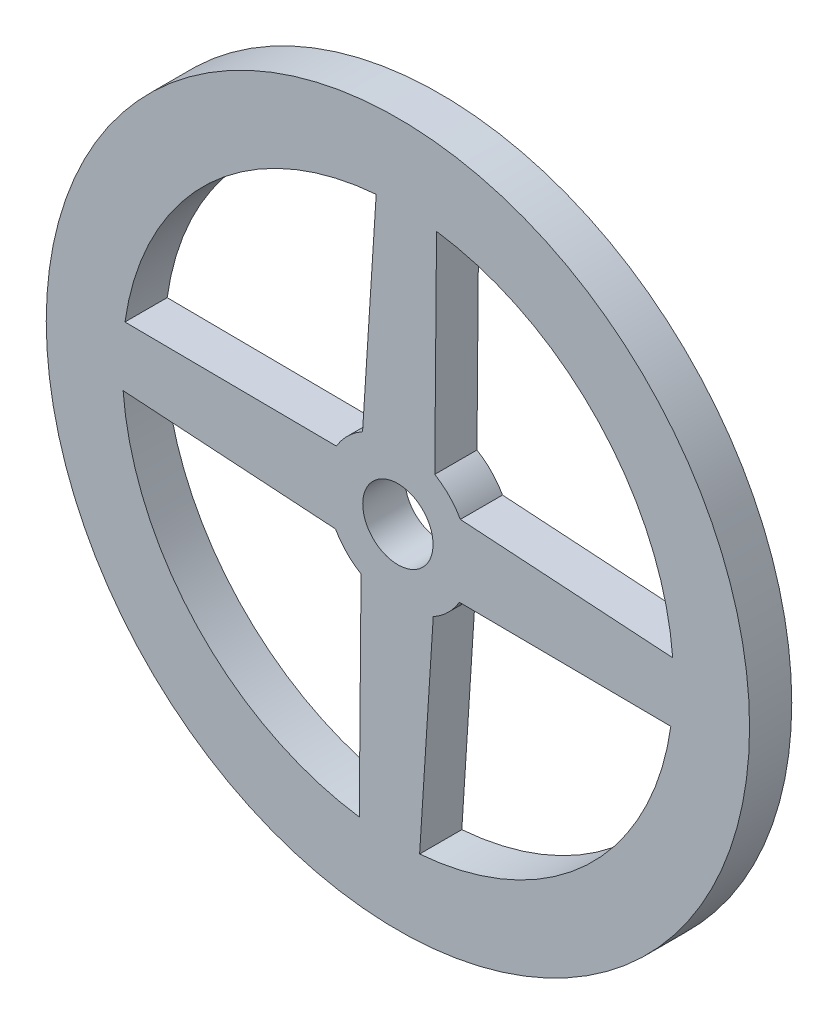
ISO-10303-21;
HEADER;
FILE_DESCRIPTION(('STEP AP214'),'2;1');
FILE_NAME('part.step','',(''),(''),'','','');
FILE_SCHEMA(('AUTOMOTIVE_DESIGN { 1 0 10303 214 1 1 1 1 }'));
ENDSEC;
DATA;
#1=APPLICATION_CONTEXT('core data for automotive mechanical design processes');
#2=APPLICATION_PROTOCOL_DEFINITION('international standard','automotive_design',2000,#1);
#3=PRODUCT_CONTEXT('',#1,'mechanical');
#4=PRODUCT('Part','Part','',(#3));
#5=PRODUCT_RELATED_PRODUCT_CATEGORY('part','',(#4));
#6=PRODUCT_DEFINITION_FORMATION('','',#4);
#7=PRODUCT_DEFINITION_CONTEXT('part definition',#1,'design');
#8=PRODUCT_DEFINITION('design','',#6,#7);
#9=PRODUCT_DEFINITION_SHAPE('','',#8);
#10=(LENGTH_UNIT() NAMED_UNIT(*) SI_UNIT(.MILLI.,.METRE.));
#11=(NAMED_UNIT(*) PLANE_ANGLE_UNIT() SI_UNIT($,.RADIAN.));
#12=(NAMED_UNIT(*) SI_UNIT($,.STERADIAN.) SOLID_ANGLE_UNIT());
#13=UNCERTAINTY_MEASURE_WITH_UNIT(LENGTH_MEASURE(1.E-05),#10,'distance_accuracy_value','');
#14=(GEOMETRIC_REPRESENTATION_CONTEXT(3) GLOBAL_UNCERTAINTY_ASSIGNED_CONTEXT((#13)) GLOBAL_UNIT_ASSIGNED_CONTEXT((#10,
#11,#12)) REPRESENTATION_CONTEXT('',''));
#15=CARTESIAN_POINT('',(0.,0.,0.));
#16=DIRECTION('',(0.,0.,1.));
#17=DIRECTION('',(1.,0.,0.));
#18=AXIS2_PLACEMENT_3D('',#15,#16,#17);
#19=CARTESIAN_POINT('',(0.,0.,3.));
#20=DIRECTION('',(0.,0.,1.));
#21=DIRECTION('',(1.,0.,0.));
#22=AXIS2_PLACEMENT_3D('',#19,#20,#21);
#23=PLANE('',#22);
#24=CARTESIAN_POINT('',(0.,0.,3.));
#25=DIRECTION('',(0.,0.,-1.));
#26=DIRECTION('',(-1.,0.,0.));
#27=AXIS2_PLACEMENT_3D('',#24,#25,#26);
#28=CIRCLE('',#27,2.5);
#29=CARTESIAN_POINT('',(-2.5,0.,3.));
#30=VERTEX_POINT('',#29);
#31=EDGE_CURVE('E174',#30,#30,#28,.T.);
#32=ORIENTED_EDGE('',*,*,#31,.T.);
#33=EDGE_LOOP('',(#32));
#34=FACE_BOUND('',#33,.T.);
#35=CARTESIAN_POINT('',(0.,0.,3.));
#36=DIRECTION('',(0.,0.,1.));
#37=DIRECTION('',(1.,0.,0.));
#38=AXIS2_PLACEMENT_3D('',#35,#36,#37);
#39=CIRCLE('',#38,25.);
#40=CARTESIAN_POINT('',(25.,0.,3.));
#41=VERTEX_POINT('',#40);
#42=EDGE_CURVE('E11',#41,#41,#39,.T.);
#43=ORIENTED_EDGE('',*,*,#42,.T.);
#44=EDGE_LOOP('',(#43));
#45=FACE_BOUND('',#44,.T.);
#46=DIRECTION('',(-0.00834775394439594,-0.999965156895021,0.));
#47=VECTOR('',#46,1.);
#48=CARTESIAN_POINT('',(2.74591126191305,19.4019976039828,3.));
#49=LINE('',#48,#47);
#50=CARTESIAN_POINT('',(2.74591126191305,19.4019976039828,3.));
#51=VERTEX_POINT('',#50);
#52=CARTESIAN_POINT('',(2.6204739005013,4.37604072742611,3.));
#53=VERTEX_POINT('',#52);
#54=EDGE_CURVE('E248',#51,#53,#49,.T.);
#55=ORIENTED_EDGE('',*,*,#54,.F.);
#56=CARTESIAN_POINT('',(0.,0.,3.));
#57=DIRECTION('',(0.,0.,1.));
#58=DIRECTION('',(-1.,0.,0.));
#59=AXIS2_PLACEMENT_3D('',#56,#57,#58);
#60=CIRCLE('',#59,19.5953448472655);
#61=CARTESIAN_POINT('',(19.5344733282336,1.54333776983081,3.));
#62=VERTEX_POINT('',#61);
#63=EDGE_CURVE('E246',#62,#51,#60,.T.);
#64=ORIENTED_EDGE('',*,*,#63,.F.);
#65=DIRECTION('',(0.997945295130962,-0.0640717404631415,0.));
#66=VECTOR('',#65,1.);
#67=CARTESIAN_POINT('',(4.43889784814874,2.51252896600238,3.));
#68=LINE('',#67,#66);
#69=CARTESIAN_POINT('',(4.43889784814874,2.51252896600238,3.));
#70=VERTEX_POINT('',#69);
#71=EDGE_CURVE('E254',#70,#62,#68,.T.);
#72=ORIENTED_EDGE('',*,*,#71,.F.);
#73=CARTESIAN_POINT('',(0.,0.,3.));
#74=DIRECTION('',(0.,0.,-1.));
#75=DIRECTION('',(-1.,0.,0.));
#76=AXIS2_PLACEMENT_3D('',#73,#74,#75);
#77=CIRCLE('',#76,5.10064857751448);
#78=EDGE_CURVE('E251',#53,#70,#77,.T.);
#79=ORIENTED_EDGE('',*,*,#78,.F.);
#80=EDGE_LOOP('',(#55,#64,#72,#79));
#81=FACE_BOUND('',#80,.T.);
#82=DIRECTION('',(-0.999965156895021,0.00834775394439591,0.));
#83=VECTOR('',#82,1.);
#84=CARTESIAN_POINT('',(19.4019976039828,-2.74591126191305,3.));
#85=LINE('',#84,#83);
#86=CARTESIAN_POINT('',(19.4019976039828,-2.74591126191305,3.));
#87=VERTEX_POINT('',#86);
#88=CARTESIAN_POINT('',(4.37604072742611,-2.6204739005013,3.));
#89=VERTEX_POINT('',#88);
#90=EDGE_CURVE('E217',#87,#89,#85,.T.);
#91=ORIENTED_EDGE('',*,*,#90,.F.);
#92=CARTESIAN_POINT('',(0.,0.,3.));
#93=DIRECTION('',(0.,0.,1.));
#94=DIRECTION('',(-1.,0.,0.));
#95=AXIS2_PLACEMENT_3D('',#92,#93,#94);
#96=CIRCLE('',#95,19.5953448472655);
#97=CARTESIAN_POINT('',(1.54333776983082,-19.5344733282336,3.));
#98=VERTEX_POINT('',#97);
#99=EDGE_CURVE('E215',#98,#87,#96,.T.);
#100=ORIENTED_EDGE('',*,*,#99,.F.);
#101=DIRECTION('',(-0.0640717404631404,-0.997945295130963,0.));
#102=VECTOR('',#101,1.);
#103=CARTESIAN_POINT('',(2.51252896600236,-4.43889784814875,3.));
#104=LINE('',#103,#102);
#105=CARTESIAN_POINT('',(2.51252896600236,-4.43889784814875,3.));
#106=VERTEX_POINT('',#105);
#107=EDGE_CURVE('E223',#106,#98,#104,.T.);
#108=ORIENTED_EDGE('',*,*,#107,.F.);
#109=CARTESIAN_POINT('',(0.,0.,3.));
#110=DIRECTION('',(0.,0.,-1.));
#111=DIRECTION('',(-1.,0.,0.));
#112=AXIS2_PLACEMENT_3D('',#109,#110,#111);
#113=CIRCLE('',#112,5.10064857751448);
#114=EDGE_CURVE('E220',#89,#106,#113,.T.);
#115=ORIENTED_EDGE('',*,*,#114,.F.);
#116=EDGE_LOOP('',(#91,#100,#108,#115));
#117=FACE_BOUND('',#116,.T.);
#118=DIRECTION('',(0.00834775394439579,0.999965156895021,0.));
#119=VECTOR('',#118,1.);
#120=CARTESIAN_POINT('',(-2.74591126191305,-19.4019976039828,3.));
#121=LINE('',#120,#119);
#122=CARTESIAN_POINT('',(-2.74591126191305,-19.4019976039828,3.));
#123=VERTEX_POINT('',#122);
#124=CARTESIAN_POINT('',(-2.6204739005013,-4.37604072742611,3.));
#125=VERTEX_POINT('',#124);
#126=EDGE_CURVE('E186',#123,#125,#121,.T.);
#127=ORIENTED_EDGE('',*,*,#126,.F.);
#128=CARTESIAN_POINT('',(0.,0.,3.));
#129=DIRECTION('',(0.,0.,1.));
#130=DIRECTION('',(-1.,0.,0.));
#131=AXIS2_PLACEMENT_3D('',#128,#129,#130);
#132=CIRCLE('',#131,19.5953448472655);
#133=CARTESIAN_POINT('',(-19.5344733282336,-1.54333776983082,3.));
#134=VERTEX_POINT('',#133);
#135=EDGE_CURVE('E184',#134,#123,#132,.T.);
#136=ORIENTED_EDGE('',*,*,#135,.F.);
#137=DIRECTION('',(-0.997945295130963,0.0640717404631394,0.));
#138=VECTOR('',#137,1.);
#139=CARTESIAN_POINT('',(-4.43889784814876,-2.51252896600235,3.));
#140=LINE('',#139,#138);
#141=CARTESIAN_POINT('',(-4.43889784814876,-2.51252896600234,3.));
#142=VERTEX_POINT('',#141);
#143=EDGE_CURVE('E192',#142,#134,#140,.T.);
#144=ORIENTED_EDGE('',*,*,#143,.F.);
#145=CARTESIAN_POINT('',(0.,0.,3.));
#146=DIRECTION('',(0.,0.,-1.));
#147=DIRECTION('',(-1.,0.,0.));
#148=AXIS2_PLACEMENT_3D('',#145,#146,#147);
#149=CIRCLE('',#148,5.10064857751448);
#150=EDGE_CURVE('E189',#125,#142,#149,.T.);
#151=ORIENTED_EDGE('',*,*,#150,.F.);
#152=EDGE_LOOP('',(#127,#136,#144,#151));
#153=FACE_BOUND('',#152,.T.);
#154=DIRECTION('',(0.999965156895021,-0.00834775394439576,0.));
#155=VECTOR('',#154,1.);
#156=CARTESIAN_POINT('',(-19.4019976039828,2.74591126191305,3.));
#157=LINE('',#156,#155);
#158=CARTESIAN_POINT('',(-19.4019976039828,2.74591126191305,3.));
#159=VERTEX_POINT('',#158);
#160=CARTESIAN_POINT('',(-4.37604072742611,2.6204739005013,3.));
#161=VERTEX_POINT('',#160);
#162=EDGE_CURVE('E154',#159,#161,#157,.T.);
#163=ORIENTED_EDGE('',*,*,#162,.F.);
#164=CARTESIAN_POINT('',(0.,0.,3.));
#165=DIRECTION('',(0.,0.,1.));
#166=DIRECTION('',(-1.,0.,0.));
#167=AXIS2_PLACEMENT_3D('',#164,#165,#166);
#168=CIRCLE('',#167,19.5953448472655);
#169=CARTESIAN_POINT('',(-1.54333776983082,19.5344733282336,3.));
#170=VERTEX_POINT('',#169);
#171=EDGE_CURVE('E146',#170,#159,#168,.T.);
#172=ORIENTED_EDGE('',*,*,#171,.F.);
#173=DIRECTION('',(0.0640717404631383,0.997945295130963,0.));
#174=VECTOR('',#173,1.);
#175=CARTESIAN_POINT('',(-2.51252896600233,4.43889784814877,3.));
#176=LINE('',#175,#174);
#177=CARTESIAN_POINT('',(-2.51252896600233,4.43889784814877,3.));
#178=VERTEX_POINT('',#177);
#179=EDGE_CURVE('E168',#178,#170,#176,.T.);
#180=ORIENTED_EDGE('',*,*,#179,.F.);
#181=CARTESIAN_POINT('',(0.,0.,3.));
#182=DIRECTION('',(0.,0.,-1.));
#183=DIRECTION('',(-1.,0.,0.));
#184=AXIS2_PLACEMENT_3D('',#181,#182,#183);
#185=CIRCLE('',#184,5.10064857751448);
#186=EDGE_CURVE('E166',#161,#178,#185,.T.);
#187=ORIENTED_EDGE('',*,*,#186,.F.);
#188=EDGE_LOOP('',(#163,#172,#180,#187));
#189=FACE_BOUND('',#188,.T.);
#190=ADVANCED_FACE('F33',(#34,#45,#81,#117,#153,#189),#23,.T.);
#191=CARTESIAN_POINT('',(0.,0.,0.));
#192=DIRECTION('',(0.,0.,1.));
#193=DIRECTION('',(1.,0.,0.));
#194=AXIS2_PLACEMENT_3D('',#191,#192,#193);
#195=PLANE('',#194);
#196=CARTESIAN_POINT('',(0.,0.,0.));
#197=DIRECTION('',(0.,0.,-1.));
#198=DIRECTION('',(-1.,0.,0.));
#199=AXIS2_PLACEMENT_3D('',#196,#197,#198);
#200=CIRCLE('',#199,2.5);
#201=CARTESIAN_POINT('',(-2.5,0.,0.));
#202=VERTEX_POINT('',#201);
#203=EDGE_CURVE('E509',#202,#202,#200,.T.);
#204=ORIENTED_EDGE('',*,*,#203,.F.);
#205=EDGE_LOOP('',(#204));
#206=FACE_BOUND('',#205,.T.);
#207=CARTESIAN_POINT('',(0.,0.,0.));
#208=DIRECTION('',(0.,0.,1.));
#209=DIRECTION('',(-1.,0.,0.));
#210=AXIS2_PLACEMENT_3D('',#207,#208,#209);
#211=CIRCLE('',#210,19.5953448472655);
#212=CARTESIAN_POINT('',(-19.5344733282336,-1.54333776983082,0.));
#213=VERTEX_POINT('',#212);
#214=CARTESIAN_POINT('',(-2.74591126191305,-19.4019976039828,0.));
#215=VERTEX_POINT('',#214);
#216=EDGE_CURVE('E162',#213,#215,#211,.T.);
#217=ORIENTED_EDGE('',*,*,#216,.T.);
#218=DIRECTION('',(0.00834775394439579,0.999965156895021,0.));
#219=VECTOR('',#218,1.);
#220=CARTESIAN_POINT('',(-2.74591126191305,-19.4019976039828,0.));
#221=LINE('',#220,#219);
#222=CARTESIAN_POINT('',(-2.6204739005013,-4.37604072742611,0.));
#223=VERTEX_POINT('',#222);
#224=EDGE_CURVE('E197',#215,#223,#221,.T.);
#225=ORIENTED_EDGE('',*,*,#224,.T.);
#226=CARTESIAN_POINT('',(0.,0.,0.));
#227=DIRECTION('',(0.,0.,-1.));
#228=DIRECTION('',(-1.,0.,0.));
#229=AXIS2_PLACEMENT_3D('',#226,#227,#228);
#230=CIRCLE('',#229,5.10064857751448);
#231=CARTESIAN_POINT('',(-4.43889784814876,-2.51252896600234,0.));
#232=VERTEX_POINT('',#231);
#233=EDGE_CURVE('E200',#223,#232,#230,.T.);
#234=ORIENTED_EDGE('',*,*,#233,.T.);
#235=DIRECTION('',(-0.997945295130963,0.0640717404631394,0.));
#236=VECTOR('',#235,1.);
#237=CARTESIAN_POINT('',(-4.43889784814876,-2.51252896600235,0.));
#238=LINE('',#237,#236);
#239=EDGE_CURVE('E187',#232,#213,#238,.T.);
#240=ORIENTED_EDGE('',*,*,#239,.T.);
#241=EDGE_LOOP('',(#217,#225,#234,#240));
#242=FACE_BOUND('',#241,.T.);
#243=CARTESIAN_POINT('',(0.,0.,0.));
#244=DIRECTION('',(0.,0.,1.));
#245=DIRECTION('',(-1.,0.,0.));
#246=AXIS2_PLACEMENT_3D('',#243,#244,#245);
#247=CIRCLE('',#246,19.5953448472655);
#248=CARTESIAN_POINT('',(19.5344733282336,1.54333776983081,0.));
#249=VERTEX_POINT('',#248);
#250=CARTESIAN_POINT('',(2.74591126191305,19.4019976039828,0.));
#251=VERTEX_POINT('',#250);
#252=EDGE_CURVE('E245',#249,#251,#247,.T.);
#253=ORIENTED_EDGE('',*,*,#252,.T.);
#254=DIRECTION('',(-0.00834775394439594,-0.999965156895021,0.));
#255=VECTOR('',#254,1.);
#256=CARTESIAN_POINT('',(2.74591126191305,19.4019976039828,0.));
#257=LINE('',#256,#255);
#258=CARTESIAN_POINT('',(2.6204739005013,4.37604072742611,0.));
#259=VERTEX_POINT('',#258);
#260=EDGE_CURVE('E259',#251,#259,#257,.T.);
#261=ORIENTED_EDGE('',*,*,#260,.T.);
#262=CARTESIAN_POINT('',(0.,0.,0.));
#263=DIRECTION('',(0.,0.,-1.));
#264=DIRECTION('',(-1.,0.,0.));
#265=AXIS2_PLACEMENT_3D('',#262,#263,#264);
#266=CIRCLE('',#265,5.10064857751448);
#267=CARTESIAN_POINT('',(4.43889784814874,2.51252896600238,0.));
#268=VERTEX_POINT('',#267);
#269=EDGE_CURVE('E262',#259,#268,#266,.T.);
#270=ORIENTED_EDGE('',*,*,#269,.T.);
#271=DIRECTION('',(0.997945295130962,-0.0640717404631415,0.));
#272=VECTOR('',#271,1.);
#273=CARTESIAN_POINT('',(4.43889784814874,2.51252896600238,0.));
#274=LINE('',#273,#272);
#275=EDGE_CURVE('E249',#268,#249,#274,.T.);
#276=ORIENTED_EDGE('',*,*,#275,.T.);
#277=EDGE_LOOP('',(#253,#261,#270,#276));
#278=FACE_BOUND('',#277,.T.);
#279=CARTESIAN_POINT('',(0.,0.,0.));
#280=DIRECTION('',(0.,0.,1.));
#281=DIRECTION('',(1.,0.,0.));
#282=AXIS2_PLACEMENT_3D('',#279,#280,#281);
#283=CIRCLE('',#282,25.);
#284=CARTESIAN_POINT('',(25.,0.,0.));
#285=VERTEX_POINT('',#284);
#286=EDGE_CURVE('E37',#285,#285,#283,.T.);
#287=ORIENTED_EDGE('',*,*,#286,.F.);
#288=EDGE_LOOP('',(#287));
#289=FACE_BOUND('',#288,.T.);
#290=CARTESIAN_POINT('',(0.,0.,0.));
#291=DIRECTION('',(0.,0.,1.));
#292=DIRECTION('',(-1.,0.,0.));
#293=AXIS2_PLACEMENT_3D('',#290,#291,#292);
#294=CIRCLE('',#293,19.5953448472655);
#295=CARTESIAN_POINT('',(1.54333776983082,-19.5344733282336,0.));
#296=VERTEX_POINT('',#295);
#297=CARTESIAN_POINT('',(19.4019976039828,-2.74591126191305,0.));
#298=VERTEX_POINT('',#297);
#299=EDGE_CURVE('E214',#296,#298,#294,.T.);
#300=ORIENTED_EDGE('',*,*,#299,.T.);
#301=DIRECTION('',(-0.999965156895021,0.00834775394439591,0.));
#302=VECTOR('',#301,1.);
#303=CARTESIAN_POINT('',(19.4019976039828,-2.74591126191305,0.));
#304=LINE('',#303,#302);
#305=CARTESIAN_POINT('',(4.37604072742611,-2.6204739005013,0.));
#306=VERTEX_POINT('',#305);
#307=EDGE_CURVE('E228',#298,#306,#304,.T.);
#308=ORIENTED_EDGE('',*,*,#307,.T.);
#309=CARTESIAN_POINT('',(0.,0.,0.));
#310=DIRECTION('',(0.,0.,-1.));
#311=DIRECTION('',(-1.,0.,0.));
#312=AXIS2_PLACEMENT_3D('',#309,#310,#311);
#313=CIRCLE('',#312,5.10064857751448);
#314=CARTESIAN_POINT('',(2.51252896600236,-4.43889784814875,0.));
#315=VERTEX_POINT('',#314);
#316=EDGE_CURVE('E231',#306,#315,#313,.T.);
#317=ORIENTED_EDGE('',*,*,#316,.T.);
#318=DIRECTION('',(-0.0640717404631404,-0.997945295130963,0.));
#319=VECTOR('',#318,1.);
#320=CARTESIAN_POINT('',(2.51252896600236,-4.43889784814875,0.));
#321=LINE('',#320,#319);
#322=EDGE_CURVE('E218',#315,#296,#321,.T.);
#323=ORIENTED_EDGE('',*,*,#322,.T.);
#324=EDGE_LOOP('',(#300,#308,#317,#323));
#325=FACE_BOUND('',#324,.T.);
#326=CARTESIAN_POINT('',(0.,0.,0.));
#327=DIRECTION('',(0.,0.,1.));
#328=DIRECTION('',(-1.,0.,0.));
#329=AXIS2_PLACEMENT_3D('',#326,#327,#328);
#330=CIRCLE('',#329,19.5953448472655);
#331=CARTESIAN_POINT('',(-1.54333776983082,19.5344733282336,0.));
#332=VERTEX_POINT('',#331);
#333=CARTESIAN_POINT('',(-19.4019976039828,2.74591126191305,0.));
#334=VERTEX_POINT('',#333);
#335=EDGE_CURVE('E56',#332,#334,#330,.T.);
#336=ORIENTED_EDGE('',*,*,#335,.T.);
#337=DIRECTION('',(0.999965156895021,-0.00834775394439576,0.));
#338=VECTOR('',#337,1.);
#339=CARTESIAN_POINT('',(-19.4019976039828,2.74591126191305,0.));
#340=LINE('',#339,#338);
#341=CARTESIAN_POINT('',(-4.37604072742611,2.6204739005013,0.));
#342=VERTEX_POINT('',#341);
#343=EDGE_CURVE('E161',#334,#342,#340,.T.);
#344=ORIENTED_EDGE('',*,*,#343,.T.);
#345=CARTESIAN_POINT('',(0.,0.,0.));
#346=DIRECTION('',(0.,0.,-1.));
#347=DIRECTION('',(-1.,0.,0.));
#348=AXIS2_PLACEMENT_3D('',#345,#346,#347);
#349=CIRCLE('',#348,5.10064857751448);
#350=CARTESIAN_POINT('',(-2.51252896600233,4.43889784814877,0.));
#351=VERTEX_POINT('',#350);
#352=EDGE_CURVE('E176',#342,#351,#349,.T.);
#353=ORIENTED_EDGE('',*,*,#352,.T.);
#354=DIRECTION('',(0.0640717404631383,0.997945295130963,0.));
#355=VECTOR('',#354,1.);
#356=CARTESIAN_POINT('',(-2.51252896600233,4.43889784814877,0.));
#357=LINE('',#356,#355);
#358=EDGE_CURVE('E155',#351,#332,#357,.T.);
#359=ORIENTED_EDGE('',*,*,#358,.T.);
#360=EDGE_LOOP('',(#336,#344,#353,#359));
#361=FACE_BOUND('',#360,.T.);
#362=ADVANCED_FACE('F281',(#206,#242,#278,#289,#325,#361),#195,.F.);
#363=CARTESIAN_POINT('',(0.,0.,3.));
#364=DIRECTION('',(0.,0.,-1.));
#365=DIRECTION('',(-1.,0.,0.));
#366=AXIS2_PLACEMENT_3D('',#363,#364,#365);
#367=CYLINDRICAL_SURFACE('',#366,25.);
#368=ORIENTED_EDGE('',*,*,#42,.F.);
#369=EDGE_LOOP('',(#368));
#370=FACE_BOUND('',#369,.T.);
#371=ORIENTED_EDGE('',*,*,#286,.T.);
#372=EDGE_LOOP('',(#371));
#373=FACE_BOUND('',#372,.T.);
#374=ADVANCED_FACE('F35',(#370,#373),#367,.T.);
#375=CARTESIAN_POINT('',(0.,0.,3.));
#376=DIRECTION('',(0.,0.,-1.));
#377=DIRECTION('',(-1.,0.,0.));
#378=AXIS2_PLACEMENT_3D('',#375,#376,#377);
#379=CYLINDRICAL_SURFACE('',#378,19.5953448472655);
#380=ORIENTED_EDGE('',*,*,#252,.F.);
#381=DIRECTION('',(0.,0.,-1.));
#382=VECTOR('',#381,1.);
#383=CARTESIAN_POINT('',(19.5344733282336,1.54333776983081,3.));
#384=LINE('',#383,#382);
#385=EDGE_CURVE('E256',#62,#249,#384,.T.);
#386=ORIENTED_EDGE('',*,*,#385,.F.);
#387=ORIENTED_EDGE('',*,*,#63,.T.);
#388=DIRECTION('',(0.,0.,-1.));
#389=VECTOR('',#388,1.);
#390=CARTESIAN_POINT('',(2.74591126191305,19.4019976039828,3.));
#391=LINE('',#390,#389);
#392=EDGE_CURVE('E273',#51,#251,#391,.T.);
#393=ORIENTED_EDGE('',*,*,#392,.T.);
#394=EDGE_LOOP('',(#380,#386,#387,#393));
#395=FACE_BOUND('',#394,.T.);
#396=ADVANCED_FACE('F308',(#395),#379,.F.);
#397=CARTESIAN_POINT('',(2.74591126191305,19.4019976039828,3.));
#398=DIRECTION('',(0.999965156895021,-0.00834775394439594,0.));
#399=DIRECTION('',(0.00834775394439594,0.999965156895021,0.));
#400=AXIS2_PLACEMENT_3D('',#397,#398,#399);
#401=PLANE('',#400);
#402=ORIENTED_EDGE('',*,*,#260,.F.);
#403=ORIENTED_EDGE('',*,*,#392,.F.);
#404=ORIENTED_EDGE('',*,*,#54,.T.);
#405=DIRECTION('',(0.,0.,-1.));
#406=VECTOR('',#405,1.);
#407=CARTESIAN_POINT('',(2.6204739005013,4.37604072742611,3.));
#408=LINE('',#407,#406);
#409=EDGE_CURVE('E271',#53,#259,#408,.T.);
#410=ORIENTED_EDGE('',*,*,#409,.T.);
#411=EDGE_LOOP('',(#402,#403,#404,#410));
#412=FACE_BOUND('',#411,.T.);
#413=ADVANCED_FACE('F311',(#412),#401,.T.);
#414=CARTESIAN_POINT('',(0.,0.,3.));
#415=DIRECTION('',(0.,0.,-1.));
#416=DIRECTION('',(-1.,0.,0.));
#417=AXIS2_PLACEMENT_3D('',#414,#415,#416);
#418=CYLINDRICAL_SURFACE('',#417,5.10064857751448);
#419=ORIENTED_EDGE('',*,*,#269,.F.);
#420=ORIENTED_EDGE('',*,*,#409,.F.);
#421=ORIENTED_EDGE('',*,*,#78,.T.);
#422=DIRECTION('',(0.,0.,-1.));
#423=VECTOR('',#422,1.);
#424=CARTESIAN_POINT('',(4.43889784814874,2.51252896600238,3.));
#425=LINE('',#424,#423);
#426=EDGE_CURVE('E269',#70,#268,#425,.T.);
#427=ORIENTED_EDGE('',*,*,#426,.T.);
#428=EDGE_LOOP('',(#419,#420,#421,#427));
#429=FACE_BOUND('',#428,.T.);
#430=ADVANCED_FACE('F314',(#429),#418,.T.);
#431=CARTESIAN_POINT('',(4.43889784814874,2.51252896600238,3.));
#432=DIRECTION('',(0.0640717404631415,0.997945295130963,0.));
#433=DIRECTION('',(-0.997945295130963,0.0640717404631415,0.));
#434=AXIS2_PLACEMENT_3D('',#431,#432,#433);
#435=PLANE('',#434);
#436=ORIENTED_EDGE('',*,*,#275,.F.);
#437=ORIENTED_EDGE('',*,*,#426,.F.);
#438=ORIENTED_EDGE('',*,*,#71,.T.);
#439=ORIENTED_EDGE('',*,*,#385,.T.);
#440=EDGE_LOOP('',(#436,#437,#438,#439));
#441=FACE_BOUND('',#440,.T.);
#442=ADVANCED_FACE('F318',(#441),#435,.T.);
#443=CARTESIAN_POINT('',(0.,0.,3.));
#444=DIRECTION('',(0.,0.,-1.));
#445=DIRECTION('',(-1.,0.,0.));
#446=AXIS2_PLACEMENT_3D('',#443,#444,#445);
#447=CYLINDRICAL_SURFACE('',#446,19.5953448472655);
#448=ORIENTED_EDGE('',*,*,#299,.F.);
#449=DIRECTION('',(0.,0.,-1.));
#450=VECTOR('',#449,1.);
#451=CARTESIAN_POINT('',(1.54333776983082,-19.5344733282336,3.));
#452=LINE('',#451,#450);
#453=EDGE_CURVE('E225',#98,#296,#452,.T.);
#454=ORIENTED_EDGE('',*,*,#453,.F.);
#455=ORIENTED_EDGE('',*,*,#99,.T.);
#456=DIRECTION('',(0.,0.,-1.));
#457=VECTOR('',#456,1.);
#458=CARTESIAN_POINT('',(19.4019976039828,-2.74591126191305,3.));
#459=LINE('',#458,#457);
#460=EDGE_CURVE('E242',#87,#298,#459,.T.);
#461=ORIENTED_EDGE('',*,*,#460,.T.);
#462=EDGE_LOOP('',(#448,#454,#455,#461));
#463=FACE_BOUND('',#462,.T.);
#464=ADVANCED_FACE('F322',(#463),#447,.F.);
#465=CARTESIAN_POINT('',(19.4019976039828,-2.74591126191305,3.));
#466=DIRECTION('',(-0.00834775394439591,-0.999965156895021,0.));
#467=DIRECTION('',(0.999965156895021,-0.00834775394439591,0.));
#468=AXIS2_PLACEMENT_3D('',#465,#466,#467);
#469=PLANE('',#468);
#470=ORIENTED_EDGE('',*,*,#307,.F.);
#471=ORIENTED_EDGE('',*,*,#460,.F.);
#472=ORIENTED_EDGE('',*,*,#90,.T.);
#473=DIRECTION('',(0.,0.,-1.));
#474=VECTOR('',#473,1.);
#475=CARTESIAN_POINT('',(4.37604072742611,-2.6204739005013,3.));
#476=LINE('',#475,#474);
#477=EDGE_CURVE('E240',#89,#306,#476,.T.);
#478=ORIENTED_EDGE('',*,*,#477,.T.);
#479=EDGE_LOOP('',(#470,#471,#472,#478));
#480=FACE_BOUND('',#479,.T.);
#481=ADVANCED_FACE('F326',(#480),#469,.T.);
#482=CARTESIAN_POINT('',(0.,0.,3.));
#483=DIRECTION('',(0.,0.,-1.));
#484=DIRECTION('',(-1.,0.,0.));
#485=AXIS2_PLACEMENT_3D('',#482,#483,#484);
#486=CYLINDRICAL_SURFACE('',#485,5.10064857751448);
#487=ORIENTED_EDGE('',*,*,#316,.F.);
#488=ORIENTED_EDGE('',*,*,#477,.F.);
#489=ORIENTED_EDGE('',*,*,#114,.T.);
#490=DIRECTION('',(0.,0.,-1.));
#491=VECTOR('',#490,1.);
#492=CARTESIAN_POINT('',(2.51252896600236,-4.43889784814875,3.));
#493=LINE('',#492,#491);
#494=EDGE_CURVE('E238',#106,#315,#493,.T.);
#495=ORIENTED_EDGE('',*,*,#494,.T.);
#496=EDGE_LOOP('',(#487,#488,#489,#495));
#497=FACE_BOUND('',#496,.T.);
#498=ADVANCED_FACE('F330',(#497),#486,.T.);
#499=CARTESIAN_POINT('',(2.51252896600236,-4.43889784814875,3.));
#500=DIRECTION('',(0.997945295130963,-0.0640717404631404,0.));
#501=DIRECTION('',(0.0640717404631404,0.997945295130963,0.));
#502=AXIS2_PLACEMENT_3D('',#499,#500,#501);
#503=PLANE('',#502);
#504=ORIENTED_EDGE('',*,*,#322,.F.);
#505=ORIENTED_EDGE('',*,*,#494,.F.);
#506=ORIENTED_EDGE('',*,*,#107,.T.);
#507=ORIENTED_EDGE('',*,*,#453,.T.);
#508=EDGE_LOOP('',(#504,#505,#506,#507));
#509=FACE_BOUND('',#508,.T.);
#510=ADVANCED_FACE('F334',(#509),#503,.T.);
#511=CARTESIAN_POINT('',(0.,0.,3.));
#512=DIRECTION('',(0.,0.,-1.));
#513=DIRECTION('',(-1.,0.,0.));
#514=AXIS2_PLACEMENT_3D('',#511,#512,#513);
#515=CYLINDRICAL_SURFACE('',#514,19.5953448472655);
#516=ORIENTED_EDGE('',*,*,#216,.F.);
#517=DIRECTION('',(0.,0.,-1.));
#518=VECTOR('',#517,1.);
#519=CARTESIAN_POINT('',(-19.5344733282336,-1.54333776983082,3.));
#520=LINE('',#519,#518);
#521=EDGE_CURVE('E194',#134,#213,#520,.T.);
#522=ORIENTED_EDGE('',*,*,#521,.F.);
#523=ORIENTED_EDGE('',*,*,#135,.T.);
#524=DIRECTION('',(0.,0.,-1.));
#525=VECTOR('',#524,1.);
#526=CARTESIAN_POINT('',(-2.74591126191305,-19.4019976039828,3.));
#527=LINE('',#526,#525);
#528=EDGE_CURVE('E211',#123,#215,#527,.T.);
#529=ORIENTED_EDGE('',*,*,#528,.T.);
#530=EDGE_LOOP('',(#516,#522,#523,#529));
#531=FACE_BOUND('',#530,.T.);
#532=ADVANCED_FACE('F338',(#531),#515,.F.);
#533=CARTESIAN_POINT('',(-2.74591126191305,-19.4019976039828,3.));
#534=DIRECTION('',(-0.999965156895021,0.00834775394439579,0.));
#535=DIRECTION('',(-0.0083477539443958,-0.999965156895021,0.));
#536=AXIS2_PLACEMENT_3D('',#533,#534,#535);
#537=PLANE('',#536);
#538=ORIENTED_EDGE('',*,*,#224,.F.);
#539=ORIENTED_EDGE('',*,*,#528,.F.);
#540=ORIENTED_EDGE('',*,*,#126,.T.);
#541=DIRECTION('',(0.,0.,-1.));
#542=VECTOR('',#541,1.);
#543=CARTESIAN_POINT('',(-2.6204739005013,-4.37604072742611,3.));
#544=LINE('',#543,#542);
#545=EDGE_CURVE('E209',#125,#223,#544,.T.);
#546=ORIENTED_EDGE('',*,*,#545,.T.);
#547=EDGE_LOOP('',(#538,#539,#540,#546));
#548=FACE_BOUND('',#547,.T.);
#549=ADVANCED_FACE('F342',(#548),#537,.T.);
#550=CARTESIAN_POINT('',(0.,0.,3.));
#551=DIRECTION('',(0.,0.,-1.));
#552=DIRECTION('',(-1.,0.,0.));
#553=AXIS2_PLACEMENT_3D('',#550,#551,#552);
#554=CYLINDRICAL_SURFACE('',#553,5.10064857751448);
#555=ORIENTED_EDGE('',*,*,#233,.F.);
#556=ORIENTED_EDGE('',*,*,#545,.F.);
#557=ORIENTED_EDGE('',*,*,#150,.T.);
#558=DIRECTION('',(0.,0.,-1.));
#559=VECTOR('',#558,1.);
#560=CARTESIAN_POINT('',(-4.43889784814876,-2.51252896600234,3.));
#561=LINE('',#560,#559);
#562=EDGE_CURVE('E207',#142,#232,#561,.T.);
#563=ORIENTED_EDGE('',*,*,#562,.T.);
#564=EDGE_LOOP('',(#555,#556,#557,#563));
#565=FACE_BOUND('',#564,.T.);
#566=ADVANCED_FACE('F346',(#565),#554,.T.);
#567=CARTESIAN_POINT('',(-4.43889784814876,-2.51252896600235,3.));
#568=DIRECTION('',(-0.0640717404631394,-0.997945295130963,0.));
#569=DIRECTION('',(0.997945295130963,-0.0640717404631394,0.));
#570=AXIS2_PLACEMENT_3D('',#567,#568,#569);
#571=PLANE('',#570);
#572=ORIENTED_EDGE('',*,*,#239,.F.);
#573=ORIENTED_EDGE('',*,*,#562,.F.);
#574=ORIENTED_EDGE('',*,*,#143,.T.);
#575=ORIENTED_EDGE('',*,*,#521,.T.);
#576=EDGE_LOOP('',(#572,#573,#574,#575));
#577=FACE_BOUND('',#576,.T.);
#578=ADVANCED_FACE('F350',(#577),#571,.T.);
#579=CARTESIAN_POINT('',(0.,0.,3.));
#580=DIRECTION('',(0.,0.,-1.));
#581=DIRECTION('',(-1.,0.,0.));
#582=AXIS2_PLACEMENT_3D('',#579,#580,#581);
#583=CYLINDRICAL_SURFACE('',#582,19.5953448472655);
#584=ORIENTED_EDGE('',*,*,#335,.F.);
#585=DIRECTION('',(0.,0.,-1.));
#586=VECTOR('',#585,1.);
#587=CARTESIAN_POINT('',(-1.54333776983082,19.5344733282336,3.));
#588=LINE('',#587,#586);
#589=EDGE_CURVE('E150',#170,#332,#588,.T.);
#590=ORIENTED_EDGE('',*,*,#589,.F.);
#591=ORIENTED_EDGE('',*,*,#171,.T.);
#592=DIRECTION('',(0.,0.,-1.));
#593=VECTOR('',#592,1.);
#594=CARTESIAN_POINT('',(-19.4019976039828,2.74591126191305,3.));
#595=LINE('',#594,#593);
#596=EDGE_CURVE('E149',#159,#334,#595,.T.);
#597=ORIENTED_EDGE('',*,*,#596,.T.);
#598=EDGE_LOOP('',(#584,#590,#591,#597));
#599=FACE_BOUND('',#598,.T.);
#600=ADVANCED_FACE('F148',(#599),#583,.F.);
#601=CARTESIAN_POINT('',(-19.4019976039828,2.74591126191305,3.));
#602=DIRECTION('',(0.00834775394439576,0.999965156895021,0.));
#603=DIRECTION('',(-0.999965156895021,0.00834775394439577,0.));
#604=AXIS2_PLACEMENT_3D('',#601,#602,#603);
#605=PLANE('',#604);
#606=ORIENTED_EDGE('',*,*,#343,.F.);
#607=ORIENTED_EDGE('',*,*,#596,.F.);
#608=ORIENTED_EDGE('',*,*,#162,.T.);
#609=DIRECTION('',(0.,0.,-1.));
#610=VECTOR('',#609,1.);
#611=CARTESIAN_POINT('',(-4.37604072742611,2.6204739005013,3.));
#612=LINE('',#611,#610);
#613=EDGE_CURVE('E163',#161,#342,#612,.T.);
#614=ORIENTED_EDGE('',*,*,#613,.T.);
#615=EDGE_LOOP('',(#606,#607,#608,#614));
#616=FACE_BOUND('',#615,.T.);
#617=ADVANCED_FACE('F158',(#616),#605,.T.);
#618=CARTESIAN_POINT('',(0.,0.,3.));
#619=DIRECTION('',(0.,0.,-1.));
#620=DIRECTION('',(-1.,0.,0.));
#621=AXIS2_PLACEMENT_3D('',#618,#619,#620);
#622=CYLINDRICAL_SURFACE('',#621,5.10064857751448);
#623=ORIENTED_EDGE('',*,*,#352,.F.);
#624=ORIENTED_EDGE('',*,*,#613,.F.);
#625=ORIENTED_EDGE('',*,*,#186,.T.);
#626=DIRECTION('',(0.,0.,-1.));
#627=VECTOR('',#626,1.);
#628=CARTESIAN_POINT('',(-2.51252896600233,4.43889784814877,3.));
#629=LINE('',#628,#627);
#630=EDGE_CURVE('E48',#178,#351,#629,.T.);
#631=ORIENTED_EDGE('',*,*,#630,.T.);
#632=EDGE_LOOP('',(#623,#624,#625,#631));
#633=FACE_BOUND('',#632,.T.);
#634=ADVANCED_FACE('F290',(#633),#622,.T.);
#635=CARTESIAN_POINT('',(-2.51252896600233,4.43889784814877,3.));
#636=DIRECTION('',(-0.997945295130963,0.0640717404631383,0.));
#637=DIRECTION('',(-0.0640717404631383,-0.997945295130963,0.));
#638=AXIS2_PLACEMENT_3D('',#635,#636,#637);
#639=PLANE('',#638);
#640=ORIENTED_EDGE('',*,*,#358,.F.);
#641=ORIENTED_EDGE('',*,*,#630,.F.);
#642=ORIENTED_EDGE('',*,*,#179,.T.);
#643=ORIENTED_EDGE('',*,*,#589,.T.);
#644=EDGE_LOOP('',(#640,#641,#642,#643));
#645=FACE_BOUND('',#644,.T.);
#646=ADVANCED_FACE('F287',(#645),#639,.T.);
#647=CARTESIAN_POINT('',(0.,0.,3.));
#648=DIRECTION('',(0.,0.,-1.));
#649=DIRECTION('',(-1.,0.,0.));
#650=AXIS2_PLACEMENT_3D('',#647,#648,#649);
#651=CYLINDRICAL_SURFACE('',#650,2.5);
#652=ORIENTED_EDGE('',*,*,#31,.F.);
#653=EDGE_LOOP('',(#652));
#654=FACE_BOUND('',#653,.T.);
#655=ORIENTED_EDGE('',*,*,#203,.T.);
#656=EDGE_LOOP('',(#655));
#657=FACE_BOUND('',#656,.T.);
#658=ADVANCED_FACE('F289',(#654,#657),#651,.F.);
#659=CLOSED_SHELL('',(#190,#362,#374,#396,#413,#430,#442,#464,#481,#498,#510,#532,#549,#566,
#578,#600,#617,#634,#646,#658));
#660=MANIFOLD_SOLID_BREP('B2',#659);
#661=ADVANCED_BREP_SHAPE_REPRESENTATION('',(#18,#660),#14);
#662=SHAPE_DEFINITION_REPRESENTATION(#9,#661);
ENDSEC;
END-ISO-10303-21;
